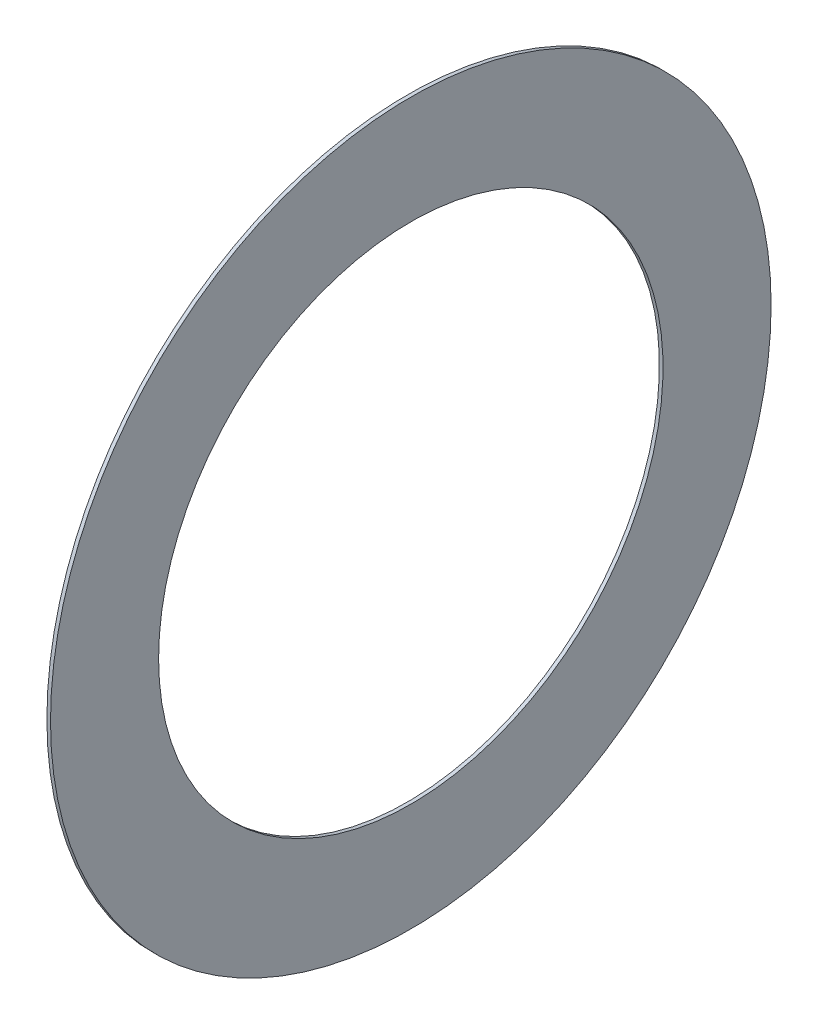
ISO-10303-21;
HEADER;
FILE_DESCRIPTION(('STEP AP214'),'2;1');
FILE_NAME('part.step','',(''),(''),'','','');
FILE_SCHEMA(('AUTOMOTIVE_DESIGN { 1 0 10303 214 1 1 1 1 }'));
ENDSEC;
DATA;
#1=APPLICATION_CONTEXT('core data for automotive mechanical design processes');
#2=APPLICATION_PROTOCOL_DEFINITION('international standard','automotive_design',2000,#1);
#3=PRODUCT_CONTEXT('',#1,'mechanical');
#4=PRODUCT('Part','Part','',(#3));
#5=PRODUCT_RELATED_PRODUCT_CATEGORY('part','',(#4));
#6=PRODUCT_DEFINITION_FORMATION('','',#4);
#7=PRODUCT_DEFINITION_CONTEXT('part definition',#1,'design');
#8=PRODUCT_DEFINITION('design','',#6,#7);
#9=PRODUCT_DEFINITION_SHAPE('','',#8);
#10=(LENGTH_UNIT() NAMED_UNIT(*) SI_UNIT(.MILLI.,.METRE.));
#11=(NAMED_UNIT(*) PLANE_ANGLE_UNIT() SI_UNIT($,.RADIAN.));
#12=(NAMED_UNIT(*) SI_UNIT($,.STERADIAN.) SOLID_ANGLE_UNIT());
#13=UNCERTAINTY_MEASURE_WITH_UNIT(LENGTH_MEASURE(1.E-05),#10,'distance_accuracy_value','');
#14=(GEOMETRIC_REPRESENTATION_CONTEXT(3) GLOBAL_UNCERTAINTY_ASSIGNED_CONTEXT((#13)) GLOBAL_UNIT_ASSIGNED_CONTEXT((#10,
#11,#12)) REPRESENTATION_CONTEXT('',''));
#15=CARTESIAN_POINT('',(0.,0.,0.));
#16=DIRECTION('',(0.,0.,1.));
#17=DIRECTION('',(1.,0.,0.));
#18=AXIS2_PLACEMENT_3D('',#15,#16,#17);
#19=CARTESIAN_POINT('',(-0.0500000000000001,7.,0.));
#20=DIRECTION('',(1.,0.,0.));
#21=DIRECTION('',(0.,0.,-1.));
#22=AXIS2_PLACEMENT_3D('',#19,#20,#21);
#23=PLANE('',#22);
#24=CARTESIAN_POINT('',(-0.0499999999999997,0.,0.));
#25=DIRECTION('',(-1.,0.,0.));
#26=DIRECTION('',(0.,0.,1.));
#27=AXIS2_PLACEMENT_3D('',#24,#25,#26);
#28=CIRCLE('',#27,7.);
#29=CARTESIAN_POINT('',(-0.0499999999999997,0.,7.));
#30=VERTEX_POINT('',#29);
#31=EDGE_CURVE('E10',#30,#30,#28,.T.);
#32=ORIENTED_EDGE('',*,*,#31,.F.);
#33=EDGE_LOOP('',(#32));
#34=FACE_BOUND('',#33,.T.);
#35=CARTESIAN_POINT('',(-0.0499999999999997,0.,0.));
#36=DIRECTION('',(-1.,0.,0.));
#37=DIRECTION('',(0.,0.,1.));
#38=AXIS2_PLACEMENT_3D('',#35,#36,#37);
#39=CIRCLE('',#38,10.);
#40=CARTESIAN_POINT('',(-0.0499999999999997,0.,10.));
#41=VERTEX_POINT('',#40);
#42=EDGE_CURVE('E47',#41,#41,#39,.T.);
#43=ORIENTED_EDGE('',*,*,#42,.T.);
#44=EDGE_LOOP('',(#43));
#45=FACE_BOUND('',#44,.T.);
#46=ADVANCED_FACE('F33',(#34,#45),#23,.F.);
#47=CARTESIAN_POINT('',(-13.3411764705882,0.,0.));
#48=DIRECTION('',(-1.,0.,0.));
#49=DIRECTION('',(0.,0.,1.));
#50=AXIS2_PLACEMENT_3D('',#47,#48,#49);
#51=CYLINDRICAL_SURFACE('',#50,7.);
#52=CARTESIAN_POINT('',(0.0499999999999997,0.,0.));
#53=DIRECTION('',(-1.,0.,0.));
#54=DIRECTION('',(0.,0.,1.));
#55=AXIS2_PLACEMENT_3D('',#52,#53,#54);
#56=CIRCLE('',#55,7.);
#57=CARTESIAN_POINT('',(0.0499999999999997,0.,7.));
#58=VERTEX_POINT('',#57);
#59=EDGE_CURVE('E39',#58,#58,#56,.T.);
#60=ORIENTED_EDGE('',*,*,#59,.F.);
#61=EDGE_LOOP('',(#60));
#62=FACE_BOUND('',#61,.T.);
#63=ORIENTED_EDGE('',*,*,#31,.T.);
#64=EDGE_LOOP('',(#63));
#65=FACE_BOUND('',#64,.T.);
#66=ADVANCED_FACE('F62',(#62,#65),#51,.F.);
#67=CARTESIAN_POINT('',(0.0500000000000001,7.,0.));
#68=DIRECTION('',(-1.,0.,0.));
#69=DIRECTION('',(0.,0.,1.));
#70=AXIS2_PLACEMENT_3D('',#67,#68,#69);
#71=PLANE('',#70);
#72=CARTESIAN_POINT('',(0.0499999999999997,0.,0.));
#73=DIRECTION('',(-1.,0.,0.));
#74=DIRECTION('',(0.,0.,1.));
#75=AXIS2_PLACEMENT_3D('',#72,#73,#74);
#76=CIRCLE('',#75,10.);
#77=CARTESIAN_POINT('',(0.0499999999999997,0.,10.));
#78=VERTEX_POINT('',#77);
#79=EDGE_CURVE('E43',#78,#78,#76,.T.);
#80=ORIENTED_EDGE('',*,*,#79,.F.);
#81=EDGE_LOOP('',(#80));
#82=FACE_BOUND('',#81,.T.);
#83=ORIENTED_EDGE('',*,*,#59,.T.);
#84=EDGE_LOOP('',(#83));
#85=FACE_BOUND('',#84,.T.);
#86=ADVANCED_FACE('F57',(#82,#85),#71,.F.);
#87=CARTESIAN_POINT('',(-13.3411764705882,0.,0.));
#88=DIRECTION('',(-1.,0.,0.));
#89=DIRECTION('',(0.,0.,1.));
#90=AXIS2_PLACEMENT_3D('',#87,#88,#89);
#91=CYLINDRICAL_SURFACE('',#90,10.);
#92=ORIENTED_EDGE('',*,*,#42,.F.);
#93=EDGE_LOOP('',(#92));
#94=FACE_BOUND('',#93,.T.);
#95=ORIENTED_EDGE('',*,*,#79,.T.);
#96=EDGE_LOOP('',(#95));
#97=FACE_BOUND('',#96,.T.);
#98=ADVANCED_FACE('F54',(#94,#97),#91,.T.);
#99=CLOSED_SHELL('',(#46,#66,#86,#98));
#100=MANIFOLD_SOLID_BREP('B2',#99);
#101=ADVANCED_BREP_SHAPE_REPRESENTATION('',(#18,#100),#14);
#102=SHAPE_DEFINITION_REPRESENTATION(#9,#101);
ENDSEC;
END-ISO-10303-21;
